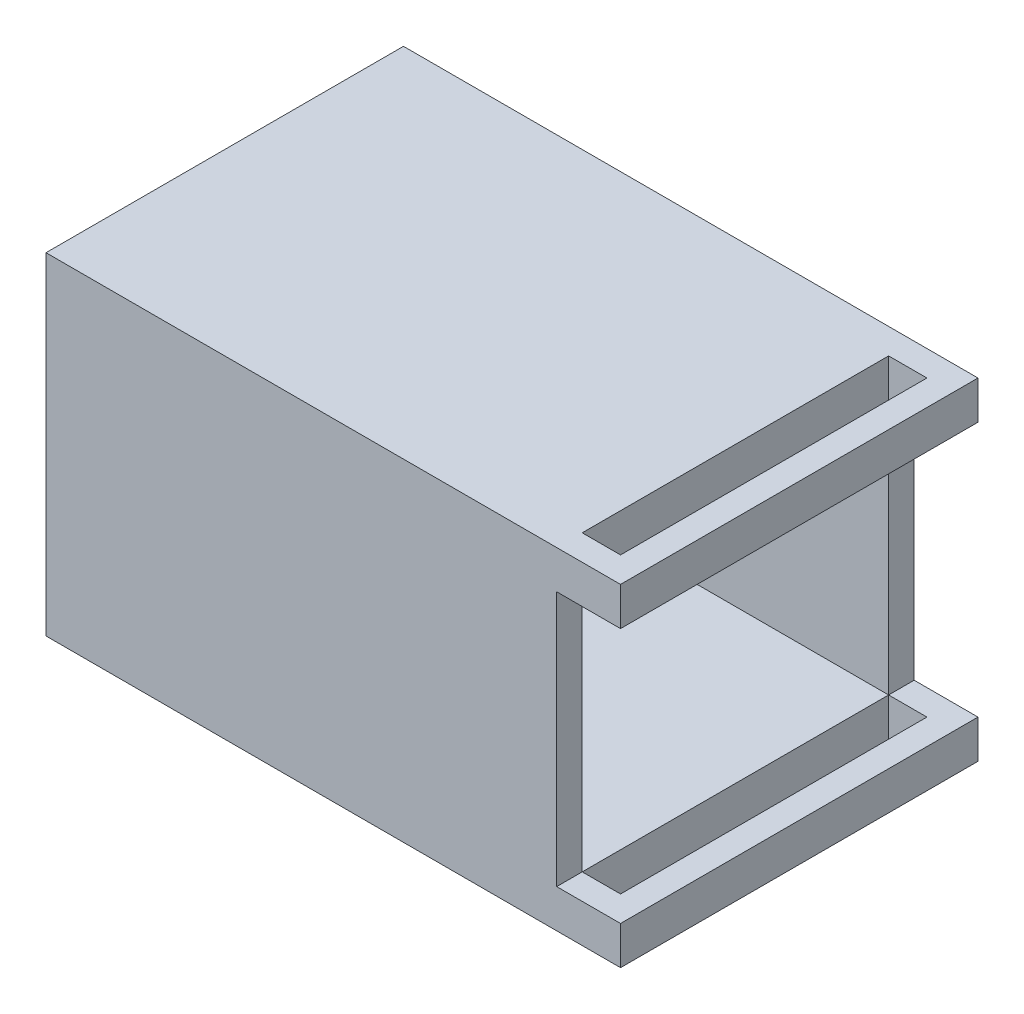
ISO-10303-21;
HEADER;
FILE_DESCRIPTION(('STEP AP214'),'2;1');
FILE_NAME('part.step','',(''),(''),'','','');
FILE_SCHEMA(('AUTOMOTIVE_DESIGN { 1 0 10303 214 1 1 1 1 }'));
ENDSEC;
DATA;
#1=APPLICATION_CONTEXT('core data for automotive mechanical design processes');
#2=APPLICATION_PROTOCOL_DEFINITION('international standard','automotive_design',2000,#1);
#3=PRODUCT_CONTEXT('',#1,'mechanical');
#4=PRODUCT('Part','Part','',(#3));
#5=PRODUCT_RELATED_PRODUCT_CATEGORY('part','',(#4));
#6=PRODUCT_DEFINITION_FORMATION('','',#4);
#7=PRODUCT_DEFINITION_CONTEXT('part definition',#1,'design');
#8=PRODUCT_DEFINITION('design','',#6,#7);
#9=PRODUCT_DEFINITION_SHAPE('','',#8);
#10=(LENGTH_UNIT() NAMED_UNIT(*) SI_UNIT(.MILLI.,.METRE.));
#11=(NAMED_UNIT(*) PLANE_ANGLE_UNIT() SI_UNIT($,.RADIAN.));
#12=(NAMED_UNIT(*) SI_UNIT($,.STERADIAN.) SOLID_ANGLE_UNIT());
#13=UNCERTAINTY_MEASURE_WITH_UNIT(LENGTH_MEASURE(1.E-05),#10,'distance_accuracy_value','');
#14=(GEOMETRIC_REPRESENTATION_CONTEXT(3) GLOBAL_UNCERTAINTY_ASSIGNED_CONTEXT((#13)) GLOBAL_UNIT_ASSIGNED_CONTEXT((#10,
#11,#12)) REPRESENTATION_CONTEXT('',''));
#15=CARTESIAN_POINT('',(0.,0.,0.));
#16=DIRECTION('',(0.,0.,1.));
#17=DIRECTION('',(1.,0.,0.));
#18=AXIS2_PLACEMENT_3D('',#15,#16,#17);
#19=CARTESIAN_POINT('',(0.,3.,0.));
#20=DIRECTION('',(0.,1.,0.));
#21=DIRECTION('',(0.,0.,1.));
#22=AXIS2_PLACEMENT_3D('',#19,#20,#21);
#23=PLANE('',#22);
#24=DIRECTION('',(0.,0.,-1.));
#25=VECTOR('',#24,1.);
#26=CARTESIAN_POINT('',(43.,3.,-2.));
#27=LINE('',#26,#25);
#28=CARTESIAN_POINT('',(43.,3.,-2.));
#29=VERTEX_POINT('',#28);
#30=CARTESIAN_POINT('',(43.,3.,-26.));
#31=VERTEX_POINT('',#30);
#32=EDGE_CURVE('E63',#29,#31,#27,.T.);
#33=ORIENTED_EDGE('',*,*,#32,.F.);
#34=DIRECTION('',(1.,0.,0.));
#35=VECTOR('',#34,1.);
#36=CARTESIAN_POINT('',(43.,3.,-2.));
#37=LINE('',#36,#35);
#38=CARTESIAN_POINT('',(40.,3.,-2.));
#39=VERTEX_POINT('',#38);
#40=EDGE_CURVE('E303',#39,#29,#37,.T.);
#41=ORIENTED_EDGE('',*,*,#40,.F.);
#42=DIRECTION('',(0.,0.,1.));
#43=VECTOR('',#42,1.);
#44=CARTESIAN_POINT('',(40.,3.,-2.));
#45=LINE('',#44,#43);
#46=CARTESIAN_POINT('',(40.,3.,0.));
#47=VERTEX_POINT('',#46);
#48=EDGE_CURVE('E528',#39,#47,#45,.T.);
#49=ORIENTED_EDGE('',*,*,#48,.T.);
#50=DIRECTION('',(1.,0.,0.));
#51=VECTOR('',#50,1.);
#52=CARTESIAN_POINT('',(0.,3.,0.));
#53=LINE('',#52,#51);
#54=CARTESIAN_POINT('',(45.,3.,0.));
#55=VERTEX_POINT('',#54);
#56=EDGE_CURVE('E569',#47,#55,#53,.T.);
#57=ORIENTED_EDGE('',*,*,#56,.T.);
#58=DIRECTION('',(0.,0.,-1.));
#59=VECTOR('',#58,1.);
#60=CARTESIAN_POINT('',(45.,3.,0.));
#61=LINE('',#60,#59);
#62=CARTESIAN_POINT('',(45.,3.,-28.));
#63=VERTEX_POINT('',#62);
#64=EDGE_CURVE('E564',#55,#63,#61,.T.);
#65=ORIENTED_EDGE('',*,*,#64,.T.);
#66=DIRECTION('',(1.,0.,0.));
#67=VECTOR('',#66,1.);
#68=CARTESIAN_POINT('',(0.,3.,-28.));
#69=LINE('',#68,#67);
#70=CARTESIAN_POINT('',(40.,3.,-28.));
#71=VERTEX_POINT('',#70);
#72=EDGE_CURVE('E561',#71,#63,#69,.T.);
#73=ORIENTED_EDGE('',*,*,#72,.F.);
#74=DIRECTION('',(0.,0.,-1.));
#75=VECTOR('',#74,1.);
#76=CARTESIAN_POINT('',(40.,3.,-26.));
#77=LINE('',#76,#75);
#78=CARTESIAN_POINT('',(40.,3.,-26.));
#79=VERTEX_POINT('',#78);
#80=EDGE_CURVE('E532',#79,#71,#77,.T.);
#81=ORIENTED_EDGE('',*,*,#80,.F.);
#82=DIRECTION('',(-1.,0.,0.));
#83=VECTOR('',#82,1.);
#84=CARTESIAN_POINT('',(43.,3.,-26.));
#85=LINE('',#84,#83);
#86=EDGE_CURVE('E316',#31,#79,#85,.T.);
#87=ORIENTED_EDGE('',*,*,#86,.F.);
#88=EDGE_LOOP('',(#33,#41,#49,#57,#65,#73,#81,#87));
#89=FACE_BOUND('',#88,.T.);
#90=ADVANCED_FACE('F47',(#89),#23,.T.);
#91=CARTESIAN_POINT('',(2.,25.,-26.));
#92=DIRECTION('',(1.,0.,0.));
#93=DIRECTION('',(0.,0.,-1.));
#94=AXIS2_PLACEMENT_3D('',#91,#92,#93);
#95=PLANE('',#94);
#96=CARTESIAN_POINT('',(2.,5.25,-17.47));
#97=DIRECTION('',(-1.,0.,0.));
#98=DIRECTION('',(0.,0.,1.));
#99=AXIS2_PLACEMENT_3D('',#96,#97,#98);
#100=CIRCLE('',#99,1.25);
#101=CARTESIAN_POINT('',(2.,5.25,-18.72));
#102=VERTEX_POINT('',#101);
#103=CARTESIAN_POINT('',(2.,4.,-17.47));
#104=VERTEX_POINT('',#103);
#105=EDGE_CURVE('E339',#102,#104,#100,.T.);
#106=ORIENTED_EDGE('',*,*,#105,.T.);
#107=DIRECTION('',(0.,0.,1.));
#108=VECTOR('',#107,1.);
#109=CARTESIAN_POINT('',(2.,4.,-17.47));
#110=LINE('',#109,#108);
#111=CARTESIAN_POINT('',(2.,4.,-10.53));
#112=VERTEX_POINT('',#111);
#113=EDGE_CURVE('E343',#104,#112,#110,.T.);
#114=ORIENTED_EDGE('',*,*,#113,.T.);
#115=CARTESIAN_POINT('',(2.,5.25,-10.53));
#116=DIRECTION('',(-1.,0.,0.));
#117=DIRECTION('',(0.,0.,1.));
#118=AXIS2_PLACEMENT_3D('',#115,#116,#117);
#119=CIRCLE('',#118,1.25);
#120=CARTESIAN_POINT('',(2.,5.25,-9.28));
#121=VERTEX_POINT('',#120);
#122=EDGE_CURVE('E348',#112,#121,#119,.T.);
#123=ORIENTED_EDGE('',*,*,#122,.T.);
#124=DIRECTION('',(0.,1.,0.));
#125=VECTOR('',#124,1.);
#126=CARTESIAN_POINT('',(2.,5.96,-9.28));
#127=LINE('',#126,#125);
#128=CARTESIAN_POINT('',(2.,5.96,-9.28));
#129=VERTEX_POINT('',#128);
#130=EDGE_CURVE('E352',#121,#129,#127,.T.);
#131=ORIENTED_EDGE('',*,*,#130,.T.);
#132=CARTESIAN_POINT('',(2.,5.96,-10.53));
#133=DIRECTION('',(-1.,0.,0.));
#134=DIRECTION('',(0.,0.,1.));
#135=AXIS2_PLACEMENT_3D('',#132,#133,#134);
#136=CIRCLE('',#135,1.25);
#137=CARTESIAN_POINT('',(2.,7.21,-10.53));
#138=VERTEX_POINT('',#137);
#139=EDGE_CURVE('E356',#129,#138,#136,.T.);
#140=ORIENTED_EDGE('',*,*,#139,.T.);
#141=DIRECTION('',(0.,0.,-1.));
#142=VECTOR('',#141,1.);
#143=CARTESIAN_POINT('',(2.,7.21,-17.47));
#144=LINE('',#143,#142);
#145=CARTESIAN_POINT('',(2.,7.21,-17.47));
#146=VERTEX_POINT('',#145);
#147=EDGE_CURVE('E360',#138,#146,#144,.T.);
#148=ORIENTED_EDGE('',*,*,#147,.T.);
#149=CARTESIAN_POINT('',(2.,5.96,-17.47));
#150=DIRECTION('',(-1.,0.,0.));
#151=DIRECTION('',(0.,0.,1.));
#152=AXIS2_PLACEMENT_3D('',#149,#150,#151);
#153=CIRCLE('',#152,1.25);
#154=CARTESIAN_POINT('',(2.,5.96,-18.72));
#155=VERTEX_POINT('',#154);
#156=EDGE_CURVE('E364',#146,#155,#153,.T.);
#157=ORIENTED_EDGE('',*,*,#156,.T.);
#158=DIRECTION('',(0.,-1.,0.));
#159=VECTOR('',#158,1.);
#160=CARTESIAN_POINT('',(2.,5.25,-18.72));
#161=LINE('',#160,#159);
#162=EDGE_CURVE('E368',#155,#102,#161,.T.);
#163=ORIENTED_EDGE('',*,*,#162,.T.);
#164=EDGE_LOOP('',(#106,#114,#123,#131,#140,#148,#157,#163));
#165=FACE_BOUND('',#164,.T.);
#166=DIRECTION('',(0.,-1.,0.));
#167=VECTOR('',#166,1.);
#168=CARTESIAN_POINT('',(2.,12.5,-18.5));
#169=LINE('',#168,#167);
#170=CARTESIAN_POINT('',(2.,12.5,-18.5));
#171=VERTEX_POINT('',#170);
#172=CARTESIAN_POINT('',(2.,8.5,-18.5));
#173=VERTEX_POINT('',#172);
#174=EDGE_CURVE('E447',#171,#173,#169,.T.);
#175=ORIENTED_EDGE('',*,*,#174,.T.);
#176=DIRECTION('',(0.,0.,1.));
#177=VECTOR('',#176,1.);
#178=CARTESIAN_POINT('',(2.,8.5,-18.5));
#179=LINE('',#178,#177);
#180=CARTESIAN_POINT('',(2.,8.5,-9.50000000000001));
#181=VERTEX_POINT('',#180);
#182=EDGE_CURVE('E464',#173,#181,#179,.T.);
#183=ORIENTED_EDGE('',*,*,#182,.T.);
#184=DIRECTION('',(0.,1.,0.));
#185=VECTOR('',#184,1.);
#186=CARTESIAN_POINT('',(2.,12.5,-9.5));
#187=LINE('',#186,#185);
#188=CARTESIAN_POINT('',(2.,12.5,-9.5));
#189=VERTEX_POINT('',#188);
#190=EDGE_CURVE('E460',#181,#189,#187,.T.);
#191=ORIENTED_EDGE('',*,*,#190,.T.);
#192=DIRECTION('',(0.,0.,-1.));
#193=VECTOR('',#192,1.);
#194=CARTESIAN_POINT('',(2.,12.5,-18.5));
#195=LINE('',#194,#193);
#196=EDGE_CURVE('E433',#189,#171,#195,.T.);
#197=ORIENTED_EDGE('',*,*,#196,.T.);
#198=EDGE_LOOP('',(#175,#183,#191,#197));
#199=FACE_BOUND('',#198,.T.);
#200=DIRECTION('',(0.,-1.,0.));
#201=VECTOR('',#200,1.);
#202=CARTESIAN_POINT('',(2.,25.,-26.));
#203=LINE('',#202,#201);
#204=CARTESIAN_POINT('',(2.,23.,-26.));
#205=VERTEX_POINT('',#204);
#206=CARTESIAN_POINT('',(2.,3.,-26.));
#207=VERTEX_POINT('',#206);
#208=EDGE_CURVE('E541',#205,#207,#203,.T.);
#209=ORIENTED_EDGE('',*,*,#208,.F.);
#210=DIRECTION('',(0.,0.,1.));
#211=VECTOR('',#210,1.);
#212=CARTESIAN_POINT('',(2.,23.,-26.));
#213=LINE('',#212,#211);
#214=CARTESIAN_POINT('',(2.,23.,-2.));
#215=VERTEX_POINT('',#214);
#216=EDGE_CURVE('E509',#205,#215,#213,.T.);
#217=ORIENTED_EDGE('',*,*,#216,.T.);
#218=DIRECTION('',(0.,-1.,0.));
#219=VECTOR('',#218,1.);
#220=CARTESIAN_POINT('',(2.,25.,-2.));
#221=LINE('',#220,#219);
#222=CARTESIAN_POINT('',(2.,3.,-2.));
#223=VERTEX_POINT('',#222);
#224=EDGE_CURVE('E540',#215,#223,#221,.T.);
#225=ORIENTED_EDGE('',*,*,#224,.T.);
#226=DIRECTION('',(0.,0.,1.));
#227=VECTOR('',#226,1.);
#228=CARTESIAN_POINT('',(2.,3.,-26.));
#229=LINE('',#228,#227);
#230=EDGE_CURVE('E520',#207,#223,#229,.T.);
#231=ORIENTED_EDGE('',*,*,#230,.F.);
#232=EDGE_LOOP('',(#209,#217,#225,#231));
#233=FACE_BOUND('',#232,.T.);
#234=ADVANCED_FACE('F662',(#165,#199,#233),#95,.T.);
#235=CARTESIAN_POINT('',(2.,25.,-26.));
#236=DIRECTION('',(0.,0.,-1.));
#237=DIRECTION('',(-1.,0.,0.));
#238=AXIS2_PLACEMENT_3D('',#235,#236,#237);
#239=PLANE('',#238);
#240=DIRECTION('',(1.,0.,0.));
#241=VECTOR('',#240,1.);
#242=CARTESIAN_POINT('',(2.,23.,-26.));
#243=LINE('',#242,#241);
#244=CARTESIAN_POINT('',(40.,23.,-26.));
#245=VERTEX_POINT('',#244);
#246=EDGE_CURVE('E512',#205,#245,#243,.T.);
#247=ORIENTED_EDGE('',*,*,#246,.F.);
#248=ORIENTED_EDGE('',*,*,#208,.T.);
#249=DIRECTION('',(1.,0.,0.));
#250=VECTOR('',#249,1.);
#251=CARTESIAN_POINT('',(2.,3.,-26.));
#252=LINE('',#251,#250);
#253=EDGE_CURVE('E536',#207,#79,#252,.T.);
#254=ORIENTED_EDGE('',*,*,#253,.T.);
#255=DIRECTION('',(0.,-1.,0.));
#256=VECTOR('',#255,1.);
#257=CARTESIAN_POINT('',(40.,25.,-26.));
#258=LINE('',#257,#256);
#259=EDGE_CURVE('E545',#245,#79,#258,.T.);
#260=ORIENTED_EDGE('',*,*,#259,.F.);
#261=EDGE_LOOP('',(#247,#248,#254,#260));
#262=FACE_BOUND('',#261,.T.);
#263=ADVANCED_FACE('F629',(#262),#239,.F.);
#264=CARTESIAN_POINT('',(40.,25.,-26.));
#265=DIRECTION('',(-1.,0.,0.));
#266=DIRECTION('',(0.,0.,1.));
#267=AXIS2_PLACEMENT_3D('',#264,#265,#266);
#268=PLANE('',#267);
#269=DIRECTION('',(0.,0.,-1.));
#270=VECTOR('',#269,1.);
#271=CARTESIAN_POINT('',(40.,23.,-26.));
#272=LINE('',#271,#270);
#273=CARTESIAN_POINT('',(40.,23.,-28.));
#274=VERTEX_POINT('',#273);
#275=EDGE_CURVE('E516',#245,#274,#272,.T.);
#276=ORIENTED_EDGE('',*,*,#275,.F.);
#277=ORIENTED_EDGE('',*,*,#259,.T.);
#278=ORIENTED_EDGE('',*,*,#80,.T.);
#279=DIRECTION('',(0.,-1.,0.));
#280=VECTOR('',#279,1.);
#281=CARTESIAN_POINT('',(40.,25.,-28.));
#282=LINE('',#281,#280);
#283=EDGE_CURVE('E549',#274,#71,#282,.T.);
#284=ORIENTED_EDGE('',*,*,#283,.F.);
#285=EDGE_LOOP('',(#276,#277,#278,#284));
#286=FACE_BOUND('',#285,.T.);
#287=ADVANCED_FACE('F626',(#286),#268,.F.);
#288=CARTESIAN_POINT('',(40.,25.,-2.));
#289=DIRECTION('',(1.,0.,0.));
#290=DIRECTION('',(0.,0.,-1.));
#291=AXIS2_PLACEMENT_3D('',#288,#289,#290);
#292=PLANE('',#291);
#293=DIRECTION('',(0.,-1.,0.));
#294=VECTOR('',#293,1.);
#295=CARTESIAN_POINT('',(40.,25.,-2.));
#296=LINE('',#295,#294);
#297=CARTESIAN_POINT('',(40.,23.,-2.));
#298=VERTEX_POINT('',#297);
#299=EDGE_CURVE('E555',#298,#39,#296,.T.);
#300=ORIENTED_EDGE('',*,*,#299,.F.);
#301=DIRECTION('',(0.,0.,1.));
#302=VECTOR('',#301,1.);
#303=CARTESIAN_POINT('',(40.,23.,-2.));
#304=LINE('',#303,#302);
#305=CARTESIAN_POINT('',(40.,23.,0.));
#306=VERTEX_POINT('',#305);
#307=EDGE_CURVE('E504',#298,#306,#304,.T.);
#308=ORIENTED_EDGE('',*,*,#307,.T.);
#309=DIRECTION('',(0.,-1.,0.));
#310=VECTOR('',#309,1.);
#311=CARTESIAN_POINT('',(40.,25.,0.));
#312=LINE('',#311,#310);
#313=EDGE_CURVE('E552',#306,#47,#312,.T.);
#314=ORIENTED_EDGE('',*,*,#313,.T.);
#315=ORIENTED_EDGE('',*,*,#48,.F.);
#316=EDGE_LOOP('',(#300,#308,#314,#315));
#317=FACE_BOUND('',#316,.T.);
#318=ADVANCED_FACE('F644',(#317),#292,.T.);
#319=CARTESIAN_POINT('',(2.,25.,-2.));
#320=DIRECTION('',(0.,0.,-1.));
#321=DIRECTION('',(-1.,0.,0.));
#322=AXIS2_PLACEMENT_3D('',#319,#320,#321);
#323=PLANE('',#322);
#324=ORIENTED_EDGE('',*,*,#224,.F.);
#325=DIRECTION('',(1.,0.,0.));
#326=VECTOR('',#325,1.);
#327=CARTESIAN_POINT('',(2.,23.,-2.));
#328=LINE('',#327,#326);
#329=EDGE_CURVE('E11',#215,#298,#328,.T.);
#330=ORIENTED_EDGE('',*,*,#329,.T.);
#331=ORIENTED_EDGE('',*,*,#299,.T.);
#332=DIRECTION('',(1.,0.,0.));
#333=VECTOR('',#332,1.);
#334=CARTESIAN_POINT('',(2.,3.,-2.));
#335=LINE('',#334,#333);
#336=EDGE_CURVE('E524',#223,#39,#335,.T.);
#337=ORIENTED_EDGE('',*,*,#336,.F.);
#338=EDGE_LOOP('',(#324,#330,#331,#337));
#339=FACE_BOUND('',#338,.T.);
#340=ADVANCED_FACE('F656',(#339),#323,.T.);
#341=DIRECTION('',(0.,0.,1.));
#342=VECTOR('',#341,1.);
#343=CARTESIAN_POINT('',(40.,3.,-2.));
#344=LINE('',#343,#342);
#345=EDGE_CURVE('E320',#79,#39,#344,.T.);
#346=ORIENTED_EDGE('',*,*,#345,.F.);
#347=ORIENTED_EDGE('',*,*,#253,.F.);
#348=ORIENTED_EDGE('',*,*,#230,.T.);
#349=ORIENTED_EDGE('',*,*,#336,.T.);
#350=EDGE_LOOP('',(#346,#347,#348,#349));
#351=FACE_BOUND('',#350,.T.);
#352=ADVANCED_FACE('F659',(#351),#23,.T.);
#353=CARTESIAN_POINT('',(0.,3.,-28.));
#354=DIRECTION('',(0.,0.,-1.));
#355=DIRECTION('',(-1.,0.,0.));
#356=AXIS2_PLACEMENT_3D('',#353,#354,#355);
#357=PLANE('',#356);
#358=DIRECTION('',(-1.,0.,0.));
#359=VECTOR('',#358,1.);
#360=CARTESIAN_POINT('',(0.,23.,-28.));
#361=LINE('',#360,#359);
#362=CARTESIAN_POINT('',(45.,23.,-28.));
#363=VERTEX_POINT('',#362);
#364=EDGE_CURVE('E496',#363,#274,#361,.T.);
#365=ORIENTED_EDGE('',*,*,#364,.T.);
#366=ORIENTED_EDGE('',*,*,#283,.T.);
#367=ORIENTED_EDGE('',*,*,#72,.T.);
#368=DIRECTION('',(0.,-1.,0.));
#369=VECTOR('',#368,1.);
#370=CARTESIAN_POINT('',(45.,3.,-28.));
#371=LINE('',#370,#369);
#372=CARTESIAN_POINT('',(45.,0.,-28.));
#373=VERTEX_POINT('',#372);
#374=EDGE_CURVE('E572',#63,#373,#371,.T.);
#375=ORIENTED_EDGE('',*,*,#374,.T.);
#376=DIRECTION('',(1.,0.,0.));
#377=VECTOR('',#376,1.);
#378=CARTESIAN_POINT('',(0.,0.,-28.));
#379=LINE('',#378,#377);
#380=CARTESIAN_POINT('',(0.,0.,-28.));
#381=VERTEX_POINT('',#380);
#382=EDGE_CURVE('E544',#381,#373,#379,.T.);
#383=ORIENTED_EDGE('',*,*,#382,.F.);
#384=DIRECTION('',(0.,-1.,0.));
#385=VECTOR('',#384,1.);
#386=CARTESIAN_POINT('',(0.,3.,-28.));
#387=LINE('',#386,#385);
#388=CARTESIAN_POINT('',(0.,26.,-28.));
#389=VERTEX_POINT('',#388);
#390=EDGE_CURVE('E56',#389,#381,#387,.T.);
#391=ORIENTED_EDGE('',*,*,#390,.F.);
#392=DIRECTION('',(-1.,0.,0.));
#393=VECTOR('',#392,1.);
#394=CARTESIAN_POINT('',(0.,26.,-28.));
#395=LINE('',#394,#393);
#396=CARTESIAN_POINT('',(45.,26.,-28.));
#397=VERTEX_POINT('',#396);
#398=EDGE_CURVE('E294',#397,#389,#395,.T.);
#399=ORIENTED_EDGE('',*,*,#398,.F.);
#400=DIRECTION('',(0.,1.,0.));
#401=VECTOR('',#400,1.);
#402=CARTESIAN_POINT('',(45.,23.,-28.));
#403=LINE('',#402,#401);
#404=EDGE_CURVE('E501',#363,#397,#403,.T.);
#405=ORIENTED_EDGE('',*,*,#404,.F.);
#406=EDGE_LOOP('',(#365,#366,#367,#375,#383,#391,#399,#405));
#407=FACE_BOUND('',#406,.T.);
#408=ADVANCED_FACE('F49',(#407),#357,.T.);
#409=CARTESIAN_POINT('',(0.,3.,0.));
#410=DIRECTION('',(-1.,0.,0.));
#411=DIRECTION('',(0.,0.,1.));
#412=AXIS2_PLACEMENT_3D('',#409,#410,#411);
#413=PLANE('',#412);
#414=CARTESIAN_POINT('',(0.,5.25,-17.47));
#415=DIRECTION('',(-1.,0.,0.));
#416=DIRECTION('',(0.,0.,1.));
#417=AXIS2_PLACEMENT_3D('',#414,#415,#416);
#418=CIRCLE('',#417,1.25);
#419=CARTESIAN_POINT('',(0.,5.25,-18.72));
#420=VERTEX_POINT('',#419);
#421=CARTESIAN_POINT('',(0.,4.,-17.47));
#422=VERTEX_POINT('',#421);
#423=EDGE_CURVE('E373',#420,#422,#418,.T.);
#424=ORIENTED_EDGE('',*,*,#423,.F.);
#425=DIRECTION('',(0.,-1.,0.));
#426=VECTOR('',#425,1.);
#427=CARTESIAN_POINT('',(0.,5.25,-18.72));
#428=LINE('',#427,#426);
#429=CARTESIAN_POINT('',(0.,5.96,-18.72));
#430=VERTEX_POINT('',#429);
#431=EDGE_CURVE('E344',#430,#420,#428,.T.);
#432=ORIENTED_EDGE('',*,*,#431,.F.);
#433=CARTESIAN_POINT('',(0.,5.96,-17.47));
#434=DIRECTION('',(-1.,0.,0.));
#435=DIRECTION('',(0.,0.,1.));
#436=AXIS2_PLACEMENT_3D('',#433,#434,#435);
#437=CIRCLE('',#436,1.25);
#438=CARTESIAN_POINT('',(0.,7.21,-17.47));
#439=VERTEX_POINT('',#438);
#440=EDGE_CURVE('E397',#439,#430,#437,.T.);
#441=ORIENTED_EDGE('',*,*,#440,.F.);
#442=DIRECTION('',(0.,0.,-1.));
#443=VECTOR('',#442,1.);
#444=CARTESIAN_POINT('',(0.,7.21,-17.47));
#445=LINE('',#444,#443);
#446=CARTESIAN_POINT('',(0.,7.21,-10.53));
#447=VERTEX_POINT('',#446);
#448=EDGE_CURVE('E393',#447,#439,#445,.T.);
#449=ORIENTED_EDGE('',*,*,#448,.F.);
#450=CARTESIAN_POINT('',(0.,5.96,-10.53));
#451=DIRECTION('',(-1.,0.,0.));
#452=DIRECTION('',(0.,0.,1.));
#453=AXIS2_PLACEMENT_3D('',#450,#451,#452);
#454=CIRCLE('',#453,1.25);
#455=CARTESIAN_POINT('',(0.,5.96,-9.28));
#456=VERTEX_POINT('',#455);
#457=EDGE_CURVE('E389',#456,#447,#454,.T.);
#458=ORIENTED_EDGE('',*,*,#457,.F.);
#459=DIRECTION('',(0.,1.,0.));
#460=VECTOR('',#459,1.);
#461=CARTESIAN_POINT('',(0.,5.96,-9.28));
#462=LINE('',#461,#460);
#463=CARTESIAN_POINT('',(0.,5.25,-9.28));
#464=VERTEX_POINT('',#463);
#465=EDGE_CURVE('E385',#464,#456,#462,.T.);
#466=ORIENTED_EDGE('',*,*,#465,.F.);
#467=CARTESIAN_POINT('',(0.,5.25,-10.53));
#468=DIRECTION('',(-1.,0.,0.));
#469=DIRECTION('',(0.,0.,1.));
#470=AXIS2_PLACEMENT_3D('',#467,#468,#469);
#471=CIRCLE('',#470,1.25);
#472=CARTESIAN_POINT('',(0.,4.,-10.53));
#473=VERTEX_POINT('',#472);
#474=EDGE_CURVE('E381',#473,#464,#471,.T.);
#475=ORIENTED_EDGE('',*,*,#474,.F.);
#476=DIRECTION('',(0.,0.,1.));
#477=VECTOR('',#476,1.);
#478=CARTESIAN_POINT('',(0.,4.,-17.47));
#479=LINE('',#478,#477);
#480=EDGE_CURVE('E376',#422,#473,#479,.T.);
#481=ORIENTED_EDGE('',*,*,#480,.F.);
#482=EDGE_LOOP('',(#424,#432,#441,#449,#458,#466,#475,#481));
#483=FACE_BOUND('',#482,.T.);
#484=DIRECTION('',(0.,-1.,0.));
#485=VECTOR('',#484,1.);
#486=CARTESIAN_POINT('',(0.,12.5,-18.5));
#487=LINE('',#486,#485);
#488=CARTESIAN_POINT('',(0.,12.5,-18.5));
#489=VERTEX_POINT('',#488);
#490=CARTESIAN_POINT('',(0.,8.5,-18.5));
#491=VERTEX_POINT('',#490);
#492=EDGE_CURVE('E377',#489,#491,#487,.T.);
#493=ORIENTED_EDGE('',*,*,#492,.F.);
#494=DIRECTION('',(0.,0.,-1.));
#495=VECTOR('',#494,1.);
#496=CARTESIAN_POINT('',(0.,12.5,-18.5));
#497=LINE('',#496,#495);
#498=CARTESIAN_POINT('',(0.,12.5,-9.5));
#499=VERTEX_POINT('',#498);
#500=EDGE_CURVE('E442',#499,#489,#497,.T.);
#501=ORIENTED_EDGE('',*,*,#500,.F.);
#502=DIRECTION('',(0.,1.,0.));
#503=VECTOR('',#502,1.);
#504=CARTESIAN_POINT('',(0.,12.5,-9.5));
#505=LINE('',#504,#503);
#506=CARTESIAN_POINT('',(0.,8.5,-9.5));
#507=VERTEX_POINT('',#506);
#508=EDGE_CURVE('E446',#507,#499,#505,.T.);
#509=ORIENTED_EDGE('',*,*,#508,.F.);
#510=DIRECTION('',(0.,0.,1.));
#511=VECTOR('',#510,1.);
#512=CARTESIAN_POINT('',(0.,8.5,-18.5));
#513=LINE('',#512,#511);
#514=EDGE_CURVE('E451',#491,#507,#513,.T.);
#515=ORIENTED_EDGE('',*,*,#514,.F.);
#516=EDGE_LOOP('',(#493,#501,#509,#515));
#517=FACE_BOUND('',#516,.T.);
#518=ORIENTED_EDGE('',*,*,#390,.T.);
#519=DIRECTION('',(0.,0.,-1.));
#520=VECTOR('',#519,1.);
#521=CARTESIAN_POINT('',(0.,0.,0.));
#522=LINE('',#521,#520);
#523=CARTESIAN_POINT('',(0.,0.,0.));
#524=VERTEX_POINT('',#523);
#525=EDGE_CURVE('E565',#524,#381,#522,.T.);
#526=ORIENTED_EDGE('',*,*,#525,.F.);
#527=DIRECTION('',(0.,-1.,0.));
#528=VECTOR('',#527,1.);
#529=CARTESIAN_POINT('',(0.,3.,0.));
#530=LINE('',#529,#528);
#531=CARTESIAN_POINT('',(0.,26.,0.));
#532=VERTEX_POINT('',#531);
#533=EDGE_CURVE('E588',#532,#524,#530,.T.);
#534=ORIENTED_EDGE('',*,*,#533,.F.);
#535=DIRECTION('',(0.,0.,1.));
#536=VECTOR('',#535,1.);
#537=CARTESIAN_POINT('',(0.,26.,0.));
#538=LINE('',#537,#536);
#539=EDGE_CURVE('E282',#389,#532,#538,.T.);
#540=ORIENTED_EDGE('',*,*,#539,.F.);
#541=EDGE_LOOP('',(#518,#526,#534,#540));
#542=FACE_BOUND('',#541,.T.);
#543=ADVANCED_FACE('F609',(#483,#517,#542),#413,.T.);
#544=CARTESIAN_POINT('',(0.,3.,0.));
#545=DIRECTION('',(0.,0.,-1.));
#546=DIRECTION('',(-1.,0.,0.));
#547=AXIS2_PLACEMENT_3D('',#544,#545,#546);
#548=PLANE('',#547);
#549=ORIENTED_EDGE('',*,*,#533,.T.);
#550=DIRECTION('',(1.,0.,0.));
#551=VECTOR('',#550,1.);
#552=CARTESIAN_POINT('',(0.,0.,0.));
#553=LINE('',#552,#551);
#554=CARTESIAN_POINT('',(45.,0.,0.));
#555=VERTEX_POINT('',#554);
#556=EDGE_CURVE('E580',#524,#555,#553,.T.);
#557=ORIENTED_EDGE('',*,*,#556,.T.);
#558=DIRECTION('',(0.,-1.,0.));
#559=VECTOR('',#558,1.);
#560=CARTESIAN_POINT('',(45.,3.,0.));
#561=LINE('',#560,#559);
#562=EDGE_CURVE('E591',#55,#555,#561,.T.);
#563=ORIENTED_EDGE('',*,*,#562,.F.);
#564=ORIENTED_EDGE('',*,*,#56,.F.);
#565=ORIENTED_EDGE('',*,*,#313,.F.);
#566=DIRECTION('',(1.,0.,0.));
#567=VECTOR('',#566,1.);
#568=CARTESIAN_POINT('',(0.,23.,0.));
#569=LINE('',#568,#567);
#570=CARTESIAN_POINT('',(45.,23.,0.));
#571=VERTEX_POINT('',#570);
#572=EDGE_CURVE('E484',#306,#571,#569,.T.);
#573=ORIENTED_EDGE('',*,*,#572,.T.);
#574=DIRECTION('',(0.,1.,0.));
#575=VECTOR('',#574,1.);
#576=CARTESIAN_POINT('',(45.,23.,0.));
#577=LINE('',#576,#575);
#578=CARTESIAN_POINT('',(45.,26.,0.));
#579=VERTEX_POINT('',#578);
#580=EDGE_CURVE('E500',#571,#579,#577,.T.);
#581=ORIENTED_EDGE('',*,*,#580,.T.);
#582=DIRECTION('',(1.,0.,0.));
#583=VECTOR('',#582,1.);
#584=CARTESIAN_POINT('',(0.,26.,0.));
#585=LINE('',#584,#583);
#586=EDGE_CURVE('E286',#532,#579,#585,.T.);
#587=ORIENTED_EDGE('',*,*,#586,.F.);
#588=EDGE_LOOP('',(#549,#557,#563,#564,#565,#573,#581,#587));
#589=FACE_BOUND('',#588,.T.);
#590=ADVANCED_FACE('F648',(#589),#548,.F.);
#591=CARTESIAN_POINT('',(45.,3.,0.));
#592=DIRECTION('',(-1.,0.,0.));
#593=DIRECTION('',(0.,0.,1.));
#594=AXIS2_PLACEMENT_3D('',#591,#592,#593);
#595=PLANE('',#594);
#596=DIRECTION('',(0.,0.,-1.));
#597=VECTOR('',#596,1.);
#598=CARTESIAN_POINT('',(45.,0.,0.));
#599=LINE('',#598,#597);
#600=EDGE_CURVE('E576',#555,#373,#599,.T.);
#601=ORIENTED_EDGE('',*,*,#600,.T.);
#602=ORIENTED_EDGE('',*,*,#374,.F.);
#603=ORIENTED_EDGE('',*,*,#64,.F.);
#604=ORIENTED_EDGE('',*,*,#562,.T.);
#605=EDGE_LOOP('',(#601,#602,#603,#604));
#606=FACE_BOUND('',#605,.T.);
#607=ADVANCED_FACE('F602',(#606),#595,.F.);
#608=CARTESIAN_POINT('',(0.,0.,0.));
#609=DIRECTION('',(0.,1.,0.));
#610=DIRECTION('',(0.,0.,1.));
#611=AXIS2_PLACEMENT_3D('',#608,#609,#610);
#612=PLANE('',#611);
#613=DIRECTION('',(1.,0.,0.));
#614=VECTOR('',#613,1.);
#615=CARTESIAN_POINT('',(43.,0.,-2.));
#616=LINE('',#615,#614);
#617=CARTESIAN_POINT('',(40.,0.,-2.));
#618=VERTEX_POINT('',#617);
#619=CARTESIAN_POINT('',(43.,0.,-2.));
#620=VERTEX_POINT('',#619);
#621=EDGE_CURVE('E309',#618,#620,#616,.T.);
#622=ORIENTED_EDGE('',*,*,#621,.T.);
#623=DIRECTION('',(0.,0.,-1.));
#624=VECTOR('',#623,1.);
#625=CARTESIAN_POINT('',(43.,0.,-2.));
#626=LINE('',#625,#624);
#627=CARTESIAN_POINT('',(43.,0.,-26.));
#628=VERTEX_POINT('',#627);
#629=EDGE_CURVE('E298',#620,#628,#626,.T.);
#630=ORIENTED_EDGE('',*,*,#629,.T.);
#631=DIRECTION('',(-1.,0.,0.));
#632=VECTOR('',#631,1.);
#633=CARTESIAN_POINT('',(43.,0.,-26.));
#634=LINE('',#633,#632);
#635=CARTESIAN_POINT('',(40.,0.,-26.));
#636=VERTEX_POINT('',#635);
#637=EDGE_CURVE('E302',#628,#636,#634,.T.);
#638=ORIENTED_EDGE('',*,*,#637,.T.);
#639=DIRECTION('',(0.,0.,1.));
#640=VECTOR('',#639,1.);
#641=CARTESIAN_POINT('',(40.,0.,-2.));
#642=LINE('',#641,#640);
#643=EDGE_CURVE('E71',#636,#618,#642,.T.);
#644=ORIENTED_EDGE('',*,*,#643,.T.);
#645=EDGE_LOOP('',(#622,#630,#638,#644));
#646=FACE_BOUND('',#645,.T.);
#647=ORIENTED_EDGE('',*,*,#382,.T.);
#648=ORIENTED_EDGE('',*,*,#600,.F.);
#649=ORIENTED_EDGE('',*,*,#556,.F.);
#650=ORIENTED_EDGE('',*,*,#525,.T.);
#651=EDGE_LOOP('',(#647,#648,#649,#650));
#652=FACE_BOUND('',#651,.T.);
#653=ADVANCED_FACE('F606',(#646,#652),#612,.F.);
#654=CARTESIAN_POINT('',(0.,23.,0.));
#655=DIRECTION('',(0.,1.,0.));
#656=DIRECTION('',(0.,0.,1.));
#657=AXIS2_PLACEMENT_3D('',#654,#655,#656);
#658=PLANE('',#657);
#659=DIRECTION('',(-1.,0.,0.));
#660=VECTOR('',#659,1.);
#661=CARTESIAN_POINT('',(40.,23.,-26.));
#662=LINE('',#661,#660);
#663=CARTESIAN_POINT('',(43.,23.,-26.));
#664=VERTEX_POINT('',#663);
#665=EDGE_CURVE('E259',#664,#245,#662,.T.);
#666=ORIENTED_EDGE('',*,*,#665,.T.);
#667=ORIENTED_EDGE('',*,*,#275,.T.);
#668=ORIENTED_EDGE('',*,*,#364,.F.);
#669=DIRECTION('',(0.,0.,-1.));
#670=VECTOR('',#669,1.);
#671=CARTESIAN_POINT('',(45.,23.,-28.));
#672=LINE('',#671,#670);
#673=EDGE_CURVE('E492',#571,#363,#672,.T.);
#674=ORIENTED_EDGE('',*,*,#673,.F.);
#675=ORIENTED_EDGE('',*,*,#572,.F.);
#676=ORIENTED_EDGE('',*,*,#307,.F.);
#677=DIRECTION('',(1.,0.,0.));
#678=VECTOR('',#677,1.);
#679=CARTESIAN_POINT('',(40.,23.,-2.));
#680=LINE('',#679,#678);
#681=CARTESIAN_POINT('',(43.,23.,-2.));
#682=VERTEX_POINT('',#681);
#683=EDGE_CURVE('E253',#298,#682,#680,.T.);
#684=ORIENTED_EDGE('',*,*,#683,.T.);
#685=DIRECTION('',(0.,0.,-1.));
#686=VECTOR('',#685,1.);
#687=CARTESIAN_POINT('',(43.,23.,-26.));
#688=LINE('',#687,#686);
#689=EDGE_CURVE('E475',#682,#664,#688,.T.);
#690=ORIENTED_EDGE('',*,*,#689,.T.);
#691=EDGE_LOOP('',(#666,#667,#668,#674,#675,#676,#684,#690));
#692=FACE_BOUND('',#691,.T.);
#693=ADVANCED_FACE('F621',(#692),#658,.F.);
#694=ORIENTED_EDGE('',*,*,#216,.F.);
#695=ORIENTED_EDGE('',*,*,#246,.T.);
#696=DIRECTION('',(0.,0.,1.));
#697=VECTOR('',#696,1.);
#698=CARTESIAN_POINT('',(40.,23.,-26.));
#699=LINE('',#698,#697);
#700=EDGE_CURVE('E407',#245,#298,#699,.T.);
#701=ORIENTED_EDGE('',*,*,#700,.T.);
#702=ORIENTED_EDGE('',*,*,#329,.F.);
#703=EDGE_LOOP('',(#694,#695,#701,#702));
#704=FACE_BOUND('',#703,.T.);
#705=ADVANCED_FACE('F634',(#704),#658,.F.);
#706=CARTESIAN_POINT('',(45.,23.,-28.));
#707=DIRECTION('',(1.,0.,0.));
#708=DIRECTION('',(0.,0.,-1.));
#709=AXIS2_PLACEMENT_3D('',#706,#707,#708);
#710=PLANE('',#709);
#711=ORIENTED_EDGE('',*,*,#404,.T.);
#712=DIRECTION('',(0.,0.,-1.));
#713=VECTOR('',#712,1.);
#714=CARTESIAN_POINT('',(45.,26.,0.));
#715=LINE('',#714,#713);
#716=EDGE_CURVE('E290',#579,#397,#715,.T.);
#717=ORIENTED_EDGE('',*,*,#716,.F.);
#718=ORIENTED_EDGE('',*,*,#580,.F.);
#719=ORIENTED_EDGE('',*,*,#673,.T.);
#720=EDGE_LOOP('',(#711,#717,#718,#719));
#721=FACE_BOUND('',#720,.T.);
#722=ADVANCED_FACE('F617',(#721),#710,.T.);
#723=CARTESIAN_POINT('',(40.,23.,-26.));
#724=DIRECTION('',(-1.,0.,0.));
#725=DIRECTION('',(0.,0.,1.));
#726=AXIS2_PLACEMENT_3D('',#723,#724,#725);
#727=PLANE('',#726);
#728=DIRECTION('',(0.,1.,0.));
#729=VECTOR('',#728,1.);
#730=CARTESIAN_POINT('',(40.,23.,-26.));
#731=LINE('',#730,#729);
#732=CARTESIAN_POINT('',(40.,26.,-26.));
#733=VERTEX_POINT('',#732);
#734=EDGE_CURVE('E265',#245,#733,#731,.T.);
#735=ORIENTED_EDGE('',*,*,#734,.T.);
#736=DIRECTION('',(0.,0.,1.));
#737=VECTOR('',#736,1.);
#738=CARTESIAN_POINT('',(40.,26.,-26.));
#739=LINE('',#738,#737);
#740=CARTESIAN_POINT('',(40.,26.,-2.));
#741=VERTEX_POINT('',#740);
#742=EDGE_CURVE('E262',#733,#741,#739,.T.);
#743=ORIENTED_EDGE('',*,*,#742,.T.);
#744=DIRECTION('',(0.,1.,0.));
#745=VECTOR('',#744,1.);
#746=CARTESIAN_POINT('',(40.,23.,-2.));
#747=LINE('',#746,#745);
#748=EDGE_CURVE('E245',#298,#741,#747,.T.);
#749=ORIENTED_EDGE('',*,*,#748,.F.);
#750=ORIENTED_EDGE('',*,*,#700,.F.);
#751=EDGE_LOOP('',(#735,#743,#749,#750));
#752=FACE_BOUND('',#751,.T.);
#753=ADVANCED_FACE('F263',(#752),#727,.F.);
#754=CARTESIAN_POINT('',(40.,23.,-26.));
#755=DIRECTION('',(0.,0.,-1.));
#756=DIRECTION('',(-1.,0.,0.));
#757=AXIS2_PLACEMENT_3D('',#754,#755,#756);
#758=PLANE('',#757);
#759=DIRECTION('',(0.,1.,0.));
#760=VECTOR('',#759,1.);
#761=CARTESIAN_POINT('',(43.,23.,-26.));
#762=LINE('',#761,#760);
#763=CARTESIAN_POINT('',(43.,26.,-26.));
#764=VERTEX_POINT('',#763);
#765=EDGE_CURVE('E485',#664,#764,#762,.T.);
#766=ORIENTED_EDGE('',*,*,#765,.T.);
#767=DIRECTION('',(-1.,0.,0.));
#768=VECTOR('',#767,1.);
#769=CARTESIAN_POINT('',(40.,26.,-26.));
#770=LINE('',#769,#768);
#771=EDGE_CURVE('E277',#764,#733,#770,.T.);
#772=ORIENTED_EDGE('',*,*,#771,.T.);
#773=ORIENTED_EDGE('',*,*,#734,.F.);
#774=ORIENTED_EDGE('',*,*,#665,.F.);
#775=EDGE_LOOP('',(#766,#772,#773,#774));
#776=FACE_BOUND('',#775,.T.);
#777=ADVANCED_FACE('F637',(#776),#758,.F.);
#778=CARTESIAN_POINT('',(43.,23.,-26.));
#779=DIRECTION('',(1.,0.,0.));
#780=DIRECTION('',(0.,0.,-1.));
#781=AXIS2_PLACEMENT_3D('',#778,#779,#780);
#782=PLANE('',#781);
#783=DIRECTION('',(0.,1.,0.));
#784=VECTOR('',#783,1.);
#785=CARTESIAN_POINT('',(43.,23.,-2.));
#786=LINE('',#785,#784);
#787=CARTESIAN_POINT('',(43.,26.,-2.));
#788=VERTEX_POINT('',#787);
#789=EDGE_CURVE('E258',#682,#788,#786,.T.);
#790=ORIENTED_EDGE('',*,*,#789,.T.);
#791=DIRECTION('',(0.,0.,-1.));
#792=VECTOR('',#791,1.);
#793=CARTESIAN_POINT('',(43.,26.,-26.));
#794=LINE('',#793,#792);
#795=EDGE_CURVE('E273',#788,#764,#794,.T.);
#796=ORIENTED_EDGE('',*,*,#795,.T.);
#797=ORIENTED_EDGE('',*,*,#765,.F.);
#798=ORIENTED_EDGE('',*,*,#689,.F.);
#799=EDGE_LOOP('',(#790,#796,#797,#798));
#800=FACE_BOUND('',#799,.T.);
#801=ADVANCED_FACE('F639',(#800),#782,.F.);
#802=CARTESIAN_POINT('',(40.,23.,-2.));
#803=DIRECTION('',(0.,0.,1.));
#804=DIRECTION('',(1.,0.,0.));
#805=AXIS2_PLACEMENT_3D('',#802,#803,#804);
#806=PLANE('',#805);
#807=ORIENTED_EDGE('',*,*,#748,.T.);
#808=DIRECTION('',(1.,0.,0.));
#809=VECTOR('',#808,1.);
#810=CARTESIAN_POINT('',(40.,26.,-2.));
#811=LINE('',#810,#809);
#812=EDGE_CURVE('E250',#741,#788,#811,.T.);
#813=ORIENTED_EDGE('',*,*,#812,.T.);
#814=ORIENTED_EDGE('',*,*,#789,.F.);
#815=ORIENTED_EDGE('',*,*,#683,.F.);
#816=EDGE_LOOP('',(#807,#813,#814,#815));
#817=FACE_BOUND('',#816,.T.);
#818=ADVANCED_FACE('F247',(#817),#806,.F.);
#819=CARTESIAN_POINT('',(2.,12.5,-18.5));
#820=DIRECTION('',(0.,0.,-1.));
#821=DIRECTION('',(-1.,0.,0.));
#822=AXIS2_PLACEMENT_3D('',#819,#820,#821);
#823=PLANE('',#822);
#824=ORIENTED_EDGE('',*,*,#492,.T.);
#825=DIRECTION('',(-1.,0.,0.));
#826=VECTOR('',#825,1.);
#827=CARTESIAN_POINT('',(2.,8.5,-18.5));
#828=LINE('',#827,#826);
#829=EDGE_CURVE('E429',#173,#491,#828,.T.);
#830=ORIENTED_EDGE('',*,*,#829,.F.);
#831=ORIENTED_EDGE('',*,*,#174,.F.);
#832=DIRECTION('',(-1.,0.,0.));
#833=VECTOR('',#832,1.);
#834=CARTESIAN_POINT('',(2.,12.5,-18.5));
#835=LINE('',#834,#833);
#836=EDGE_CURVE('E330',#171,#489,#835,.T.);
#837=ORIENTED_EDGE('',*,*,#836,.T.);
#838=EDGE_LOOP('',(#824,#830,#831,#837));
#839=FACE_BOUND('',#838,.T.);
#840=ADVANCED_FACE('F756',(#839),#823,.F.);
#841=CARTESIAN_POINT('',(2.,12.5,-18.5));
#842=DIRECTION('',(0.,1.,0.));
#843=DIRECTION('',(0.,0.,1.));
#844=AXIS2_PLACEMENT_3D('',#841,#842,#843);
#845=PLANE('',#844);
#846=ORIENTED_EDGE('',*,*,#500,.T.);
#847=ORIENTED_EDGE('',*,*,#836,.F.);
#848=ORIENTED_EDGE('',*,*,#196,.F.);
#849=DIRECTION('',(-1.,0.,0.));
#850=VECTOR('',#849,1.);
#851=CARTESIAN_POINT('',(2.,12.5,-9.5));
#852=LINE('',#851,#850);
#853=EDGE_CURVE('E437',#189,#499,#852,.T.);
#854=ORIENTED_EDGE('',*,*,#853,.T.);
#855=EDGE_LOOP('',(#846,#847,#848,#854));
#856=FACE_BOUND('',#855,.T.);
#857=ADVANCED_FACE('F766',(#856),#845,.F.);
#858=CARTESIAN_POINT('',(2.,12.5,-9.5));
#859=DIRECTION('',(0.,0.,1.));
#860=DIRECTION('',(1.,0.,0.));
#861=AXIS2_PLACEMENT_3D('',#858,#859,#860);
#862=PLANE('',#861);
#863=ORIENTED_EDGE('',*,*,#508,.T.);
#864=ORIENTED_EDGE('',*,*,#853,.F.);
#865=ORIENTED_EDGE('',*,*,#190,.F.);
#866=DIRECTION('',(-1.,0.,0.));
#867=VECTOR('',#866,1.);
#868=CARTESIAN_POINT('',(2.,8.5,-9.5));
#869=LINE('',#868,#867);
#870=EDGE_CURVE('E434',#181,#507,#869,.T.);
#871=ORIENTED_EDGE('',*,*,#870,.T.);
#872=EDGE_LOOP('',(#863,#864,#865,#871));
#873=FACE_BOUND('',#872,.T.);
#874=ADVANCED_FACE('F776',(#873),#862,.F.);
#875=CARTESIAN_POINT('',(2.,8.5,-18.5));
#876=DIRECTION('',(0.,-1.,0.));
#877=DIRECTION('',(0.,0.,-1.));
#878=AXIS2_PLACEMENT_3D('',#875,#876,#877);
#879=PLANE('',#878);
#880=ORIENTED_EDGE('',*,*,#514,.T.);
#881=ORIENTED_EDGE('',*,*,#870,.F.);
#882=ORIENTED_EDGE('',*,*,#182,.F.);
#883=ORIENTED_EDGE('',*,*,#829,.T.);
#884=EDGE_LOOP('',(#880,#881,#882,#883));
#885=FACE_BOUND('',#884,.T.);
#886=ADVANCED_FACE('F786',(#885),#879,.F.);
#887=CARTESIAN_POINT('',(2.,5.25,-17.47));
#888=DIRECTION('',(-1.,0.,0.));
#889=DIRECTION('',(0.,0.,1.));
#890=AXIS2_PLACEMENT_3D('',#887,#888,#889);
#891=CYLINDRICAL_SURFACE('',#890,1.25);
#892=ORIENTED_EDGE('',*,*,#423,.T.);
#893=DIRECTION('',(-1.,0.,0.));
#894=VECTOR('',#893,1.);
#895=CARTESIAN_POINT('',(2.,4.,-17.47));
#896=LINE('',#895,#894);
#897=EDGE_CURVE('E372',#104,#422,#896,.T.);
#898=ORIENTED_EDGE('',*,*,#897,.F.);
#899=ORIENTED_EDGE('',*,*,#105,.F.);
#900=DIRECTION('',(-1.,0.,0.));
#901=VECTOR('',#900,1.);
#902=CARTESIAN_POINT('',(2.,5.25,-18.72));
#903=LINE('',#902,#901);
#904=EDGE_CURVE('E404',#102,#420,#903,.T.);
#905=ORIENTED_EDGE('',*,*,#904,.T.);
#906=EDGE_LOOP('',(#892,#898,#899,#905));
#907=FACE_BOUND('',#906,.T.);
#908=ADVANCED_FACE('F796',(#907),#891,.F.);
#909=CARTESIAN_POINT('',(2.,5.25,-18.72));
#910=DIRECTION('',(0.,0.,-1.));
#911=DIRECTION('',(-1.,0.,0.));
#912=AXIS2_PLACEMENT_3D('',#909,#910,#911);
#913=PLANE('',#912);
#914=ORIENTED_EDGE('',*,*,#431,.T.);
#915=ORIENTED_EDGE('',*,*,#904,.F.);
#916=ORIENTED_EDGE('',*,*,#162,.F.);
#917=DIRECTION('',(-1.,0.,0.));
#918=VECTOR('',#917,1.);
#919=CARTESIAN_POINT('',(2.,5.96,-18.72));
#920=LINE('',#919,#918);
#921=EDGE_CURVE('E408',#155,#430,#920,.T.);
#922=ORIENTED_EDGE('',*,*,#921,.T.);
#923=EDGE_LOOP('',(#914,#915,#916,#922));
#924=FACE_BOUND('',#923,.T.);
#925=ADVANCED_FACE('F806',(#924),#913,.F.);
#926=CARTESIAN_POINT('',(2.,5.96,-17.47));
#927=DIRECTION('',(-1.,0.,0.));
#928=DIRECTION('',(0.,0.,1.));
#929=AXIS2_PLACEMENT_3D('',#926,#927,#928);
#930=CYLINDRICAL_SURFACE('',#929,1.25);
#931=ORIENTED_EDGE('',*,*,#440,.T.);
#932=ORIENTED_EDGE('',*,*,#921,.F.);
#933=ORIENTED_EDGE('',*,*,#156,.F.);
#934=DIRECTION('',(-1.,0.,0.));
#935=VECTOR('',#934,1.);
#936=CARTESIAN_POINT('',(2.,7.21,-17.47));
#937=LINE('',#936,#935);
#938=EDGE_CURVE('E411',#146,#439,#937,.T.);
#939=ORIENTED_EDGE('',*,*,#938,.T.);
#940=EDGE_LOOP('',(#931,#932,#933,#939));
#941=FACE_BOUND('',#940,.T.);
#942=ADVANCED_FACE('F816',(#941),#930,.F.);
#943=CARTESIAN_POINT('',(2.,7.21,-17.47));
#944=DIRECTION('',(0.,1.,0.));
#945=DIRECTION('',(0.,0.,1.));
#946=AXIS2_PLACEMENT_3D('',#943,#944,#945);
#947=PLANE('',#946);
#948=ORIENTED_EDGE('',*,*,#448,.T.);
#949=ORIENTED_EDGE('',*,*,#938,.F.);
#950=ORIENTED_EDGE('',*,*,#147,.F.);
#951=DIRECTION('',(-1.,0.,0.));
#952=VECTOR('',#951,1.);
#953=CARTESIAN_POINT('',(2.,7.21,-10.53));
#954=LINE('',#953,#952);
#955=EDGE_CURVE('E414',#138,#447,#954,.T.);
#956=ORIENTED_EDGE('',*,*,#955,.T.);
#957=EDGE_LOOP('',(#948,#949,#950,#956));
#958=FACE_BOUND('',#957,.T.);
#959=ADVANCED_FACE('F826',(#958),#947,.F.);
#960=CARTESIAN_POINT('',(2.,5.96,-10.53));
#961=DIRECTION('',(-1.,0.,0.));
#962=DIRECTION('',(0.,0.,1.));
#963=AXIS2_PLACEMENT_3D('',#960,#961,#962);
#964=CYLINDRICAL_SURFACE('',#963,1.25);
#965=ORIENTED_EDGE('',*,*,#457,.T.);
#966=ORIENTED_EDGE('',*,*,#955,.F.);
#967=ORIENTED_EDGE('',*,*,#139,.F.);
#968=DIRECTION('',(-1.,0.,0.));
#969=VECTOR('',#968,1.);
#970=CARTESIAN_POINT('',(2.,5.96,-9.28));
#971=LINE('',#970,#969);
#972=EDGE_CURVE('E417',#129,#456,#971,.T.);
#973=ORIENTED_EDGE('',*,*,#972,.T.);
#974=EDGE_LOOP('',(#965,#966,#967,#973));
#975=FACE_BOUND('',#974,.T.);
#976=ADVANCED_FACE('F836',(#975),#964,.F.);
#977=CARTESIAN_POINT('',(2.,5.96,-9.28));
#978=DIRECTION('',(0.,0.,1.));
#979=DIRECTION('',(0.,-1.,0.));
#980=AXIS2_PLACEMENT_3D('',#977,#978,#979);
#981=PLANE('',#980);
#982=ORIENTED_EDGE('',*,*,#465,.T.);
#983=ORIENTED_EDGE('',*,*,#972,.F.);
#984=ORIENTED_EDGE('',*,*,#130,.F.);
#985=DIRECTION('',(-1.,0.,0.));
#986=VECTOR('',#985,1.);
#987=CARTESIAN_POINT('',(2.,5.25,-9.28));
#988=LINE('',#987,#986);
#989=EDGE_CURVE('E420',#121,#464,#988,.T.);
#990=ORIENTED_EDGE('',*,*,#989,.T.);
#991=EDGE_LOOP('',(#982,#983,#984,#990));
#992=FACE_BOUND('',#991,.T.);
#993=ADVANCED_FACE('F846',(#992),#981,.F.);
#994=CARTESIAN_POINT('',(2.,5.25,-10.53));
#995=DIRECTION('',(-1.,0.,0.));
#996=DIRECTION('',(0.,0.,1.));
#997=AXIS2_PLACEMENT_3D('',#994,#995,#996);
#998=CYLINDRICAL_SURFACE('',#997,1.25);
#999=ORIENTED_EDGE('',*,*,#474,.T.);
#1000=ORIENTED_EDGE('',*,*,#989,.F.);
#1001=ORIENTED_EDGE('',*,*,#122,.F.);
#1002=DIRECTION('',(-1.,0.,0.));
#1003=VECTOR('',#1002,1.);
#1004=CARTESIAN_POINT('',(2.,4.,-10.53));
#1005=LINE('',#1004,#1003);
#1006=EDGE_CURVE('E423',#112,#473,#1005,.T.);
#1007=ORIENTED_EDGE('',*,*,#1006,.T.);
#1008=EDGE_LOOP('',(#999,#1000,#1001,#1007));
#1009=FACE_BOUND('',#1008,.T.);
#1010=ADVANCED_FACE('F856',(#1009),#998,.F.);
#1011=CARTESIAN_POINT('',(2.,4.,-17.47));
#1012=DIRECTION('',(0.,-1.,0.));
#1013=DIRECTION('',(0.,0.,-1.));
#1014=AXIS2_PLACEMENT_3D('',#1011,#1012,#1013);
#1015=PLANE('',#1014);
#1016=ORIENTED_EDGE('',*,*,#480,.T.);
#1017=ORIENTED_EDGE('',*,*,#1006,.F.);
#1018=ORIENTED_EDGE('',*,*,#113,.F.);
#1019=ORIENTED_EDGE('',*,*,#897,.T.);
#1020=EDGE_LOOP('',(#1016,#1017,#1018,#1019));
#1021=FACE_BOUND('',#1020,.T.);
#1022=ADVANCED_FACE('F866',(#1021),#1015,.F.);
#1023=CARTESIAN_POINT('',(43.,0.,-2.));
#1024=DIRECTION('',(1.,0.,0.));
#1025=DIRECTION('',(0.,0.,-1.));
#1026=AXIS2_PLACEMENT_3D('',#1023,#1024,#1025);
#1027=PLANE('',#1026);
#1028=ORIENTED_EDGE('',*,*,#32,.T.);
#1029=DIRECTION('',(0.,1.,0.));
#1030=VECTOR('',#1029,1.);
#1031=CARTESIAN_POINT('',(43.,0.,-26.));
#1032=LINE('',#1031,#1030);
#1033=EDGE_CURVE('E313',#628,#31,#1032,.T.);
#1034=ORIENTED_EDGE('',*,*,#1033,.F.);
#1035=ORIENTED_EDGE('',*,*,#629,.F.);
#1036=DIRECTION('',(0.,1.,0.));
#1037=VECTOR('',#1036,1.);
#1038=CARTESIAN_POINT('',(43.,0.,-2.));
#1039=LINE('',#1038,#1037);
#1040=EDGE_CURVE('E327',#620,#29,#1039,.T.);
#1041=ORIENTED_EDGE('',*,*,#1040,.T.);
#1042=EDGE_LOOP('',(#1028,#1034,#1035,#1041));
#1043=FACE_BOUND('',#1042,.T.);
#1044=ADVANCED_FACE('F876',(#1043),#1027,.F.);
#1045=CARTESIAN_POINT('',(43.,0.,-2.));
#1046=DIRECTION('',(0.,0.,1.));
#1047=DIRECTION('',(1.,0.,0.));
#1048=AXIS2_PLACEMENT_3D('',#1045,#1046,#1047);
#1049=PLANE('',#1048);
#1050=ORIENTED_EDGE('',*,*,#40,.T.);
#1051=ORIENTED_EDGE('',*,*,#1040,.F.);
#1052=ORIENTED_EDGE('',*,*,#621,.F.);
#1053=DIRECTION('',(0.,1.,0.));
#1054=VECTOR('',#1053,1.);
#1055=CARTESIAN_POINT('',(40.,0.,-2.));
#1056=LINE('',#1055,#1054);
#1057=EDGE_CURVE('E331',#618,#39,#1056,.T.);
#1058=ORIENTED_EDGE('',*,*,#1057,.T.);
#1059=EDGE_LOOP('',(#1050,#1051,#1052,#1058));
#1060=FACE_BOUND('',#1059,.T.);
#1061=ADVANCED_FACE('F892',(#1060),#1049,.F.);
#1062=CARTESIAN_POINT('',(40.,0.,-2.));
#1063=DIRECTION('',(-1.,0.,0.));
#1064=DIRECTION('',(0.,0.,1.));
#1065=AXIS2_PLACEMENT_3D('',#1062,#1063,#1064);
#1066=PLANE('',#1065);
#1067=ORIENTED_EDGE('',*,*,#345,.T.);
#1068=ORIENTED_EDGE('',*,*,#1057,.F.);
#1069=ORIENTED_EDGE('',*,*,#643,.F.);
#1070=DIRECTION('',(0.,1.,0.));
#1071=VECTOR('',#1070,1.);
#1072=CARTESIAN_POINT('',(40.,0.,-26.));
#1073=LINE('',#1072,#1071);
#1074=EDGE_CURVE('E334',#636,#79,#1073,.T.);
#1075=ORIENTED_EDGE('',*,*,#1074,.T.);
#1076=EDGE_LOOP('',(#1067,#1068,#1069,#1075));
#1077=FACE_BOUND('',#1076,.T.);
#1078=ADVANCED_FACE('F901',(#1077),#1066,.F.);
#1079=CARTESIAN_POINT('',(43.,0.,-26.));
#1080=DIRECTION('',(0.,0.,-1.));
#1081=DIRECTION('',(-1.,0.,0.));
#1082=AXIS2_PLACEMENT_3D('',#1079,#1080,#1081);
#1083=PLANE('',#1082);
#1084=ORIENTED_EDGE('',*,*,#86,.T.);
#1085=ORIENTED_EDGE('',*,*,#1074,.F.);
#1086=ORIENTED_EDGE('',*,*,#637,.F.);
#1087=ORIENTED_EDGE('',*,*,#1033,.T.);
#1088=EDGE_LOOP('',(#1084,#1085,#1086,#1087));
#1089=FACE_BOUND('',#1088,.T.);
#1090=ADVANCED_FACE('F910',(#1089),#1083,.F.);
#1091=CARTESIAN_POINT('',(0.,26.,0.));
#1092=DIRECTION('',(0.,-1.,0.));
#1093=DIRECTION('',(0.,0.,-1.));
#1094=AXIS2_PLACEMENT_3D('',#1091,#1092,#1093);
#1095=PLANE('',#1094);
#1096=ORIENTED_EDGE('',*,*,#539,.T.);
#1097=ORIENTED_EDGE('',*,*,#586,.T.);
#1098=ORIENTED_EDGE('',*,*,#716,.T.);
#1099=ORIENTED_EDGE('',*,*,#398,.T.);
#1100=EDGE_LOOP('',(#1096,#1097,#1098,#1099));
#1101=FACE_BOUND('',#1100,.T.);
#1102=ORIENTED_EDGE('',*,*,#742,.F.);
#1103=ORIENTED_EDGE('',*,*,#771,.F.);
#1104=ORIENTED_EDGE('',*,*,#795,.F.);
#1105=ORIENTED_EDGE('',*,*,#812,.F.);
#1106=EDGE_LOOP('',(#1102,#1103,#1104,#1105));
#1107=FACE_BOUND('',#1106,.T.);
#1108=ADVANCED_FACE('F271',(#1101,#1107),#1095,.F.);
#1109=CLOSED_SHELL('',(#90,#234,#263,#287,#318,#340,#352,#408,#543,#590,#607,#653,#693,#705,
#722,#753,#777,#801,#818,#840,#857,#874,#886,#908,#925,#942,#959,#976,#993,#1010,#1022,#1044,
#1061,#1078,#1090,#1108));
#1110=MANIFOLD_SOLID_BREP('B2',#1109);
#1111=ADVANCED_BREP_SHAPE_REPRESENTATION('',(#18,#1110),#14);
#1112=SHAPE_DEFINITION_REPRESENTATION(#9,#1111);
ENDSEC;
END-ISO-10303-21;
